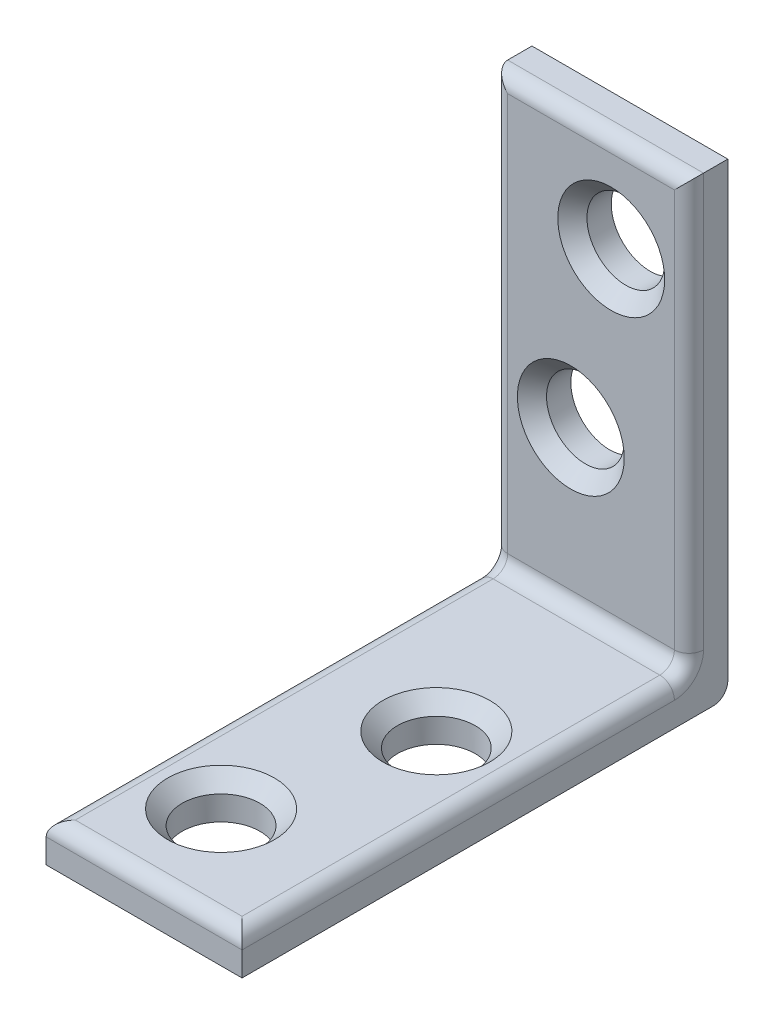
ISO-10303-21;
HEADER;
FILE_DESCRIPTION(('STEP AP214'),'2;1');
FILE_NAME('part.step','',(''),(''),'','','');
FILE_SCHEMA(('AUTOMOTIVE_DESIGN { 1 0 10303 214 1 1 1 1 }'));
ENDSEC;
DATA;
#1=APPLICATION_CONTEXT('core data for automotive mechanical design processes');
#2=APPLICATION_PROTOCOL_DEFINITION('international standard','automotive_design',2000,#1);
#3=PRODUCT_CONTEXT('',#1,'mechanical');
#4=PRODUCT('Part','Part','',(#3));
#5=PRODUCT_RELATED_PRODUCT_CATEGORY('part','',(#4));
#6=PRODUCT_DEFINITION_FORMATION('','',#4);
#7=PRODUCT_DEFINITION_CONTEXT('part definition',#1,'design');
#8=PRODUCT_DEFINITION('design','',#6,#7);
#9=PRODUCT_DEFINITION_SHAPE('','',#8);
#10=(LENGTH_UNIT() NAMED_UNIT(*) SI_UNIT(.MILLI.,.METRE.));
#11=(NAMED_UNIT(*) PLANE_ANGLE_UNIT() SI_UNIT($,.RADIAN.));
#12=(NAMED_UNIT(*) SI_UNIT($,.STERADIAN.) SOLID_ANGLE_UNIT());
#13=UNCERTAINTY_MEASURE_WITH_UNIT(LENGTH_MEASURE(1.E-05),#10,'distance_accuracy_value','');
#14=(GEOMETRIC_REPRESENTATION_CONTEXT(3) GLOBAL_UNCERTAINTY_ASSIGNED_CONTEXT((#13)) GLOBAL_UNIT_ASSIGNED_CONTEXT((#10,
#11,#12)) REPRESENTATION_CONTEXT('',''));
#15=CARTESIAN_POINT('',(0.,0.,0.));
#16=DIRECTION('',(0.,0.,1.));
#17=DIRECTION('',(1.,0.,0.));
#18=AXIS2_PLACEMENT_3D('',#15,#16,#17);
#19=CARTESIAN_POINT('',(0.,3.175,0.));
#20=DIRECTION('',(1.,0.,0.));
#21=DIRECTION('',(0.,0.,-1.));
#22=AXIS2_PLACEMENT_3D('',#19,#20,#21);
#23=PLANE('',#22);
#24=DIRECTION('',(0.,-1.,0.));
#25=VECTOR('',#24,1.);
#26=CARTESIAN_POINT('',(0.,38.1,-39.6875));
#27=LINE('',#26,#25);
#28=CARTESIAN_POINT('',(0.,38.1,-39.6875));
#29=VERTEX_POINT('',#28);
#30=CARTESIAN_POINT('',(0.,1.19062500000001,-39.6875));
#31=VERTEX_POINT('',#30);
#32=EDGE_CURVE('E130',#29,#31,#27,.T.);
#33=ORIENTED_EDGE('',*,*,#32,.T.);
#34=CARTESIAN_POINT('',(0.,1.190625,-38.496875));
#35=DIRECTION('',(1.,0.,0.));
#36=DIRECTION('',(0.,0.,-1.));
#37=AXIS2_PLACEMENT_3D('',#34,#35,#36);
#38=CIRCLE('',#37,1.190625);
#39=CARTESIAN_POINT('',(0.,0.,-38.496875));
#40=VERTEX_POINT('',#39);
#41=EDGE_CURVE('E213',#31,#40,#38,.F.);
#42=ORIENTED_EDGE('',*,*,#41,.T.);
#43=DIRECTION('',(0.,0.,1.));
#44=VECTOR('',#43,1.);
#45=CARTESIAN_POINT('',(0.,0.,0.));
#46=LINE('',#45,#44);
#47=CARTESIAN_POINT('',(0.,0.,0.));
#48=VERTEX_POINT('',#47);
#49=EDGE_CURVE('E156',#40,#48,#46,.T.);
#50=ORIENTED_EDGE('',*,*,#49,.T.);
#51=DIRECTION('',(0.,-1.,0.));
#52=VECTOR('',#51,1.);
#53=CARTESIAN_POINT('',(0.,3.175,0.));
#54=LINE('',#53,#52);
#55=CARTESIAN_POINT('',(0.,1.984375,0.));
#56=VERTEX_POINT('',#55);
#57=EDGE_CURVE('E168',#56,#48,#54,.T.);
#58=ORIENTED_EDGE('',*,*,#57,.F.);
#59=DIRECTION('',(0.,0.,1.));
#60=VECTOR('',#59,1.);
#61=CARTESIAN_POINT('',(0.,1.984375,0.));
#62=LINE('',#61,#60);
#63=CARTESIAN_POINT('',(0.,1.984375,-35.321875));
#64=VERTEX_POINT('',#63);
#65=EDGE_CURVE('E210',#56,#64,#62,.F.);
#66=ORIENTED_EDGE('',*,*,#65,.T.);
#67=CARTESIAN_POINT('',(0.,4.365625,-35.321875));
#68=DIRECTION('',(1.,0.,0.));
#69=DIRECTION('',(0.,0.,-1.));
#70=AXIS2_PLACEMENT_3D('',#67,#68,#69);
#71=CIRCLE('',#70,2.38125);
#72=CARTESIAN_POINT('',(0.,4.365625,-37.703125));
#73=VERTEX_POINT('',#72);
#74=EDGE_CURVE('E207',#73,#64,#71,.F.);
#75=ORIENTED_EDGE('',*,*,#74,.F.);
#76=DIRECTION('',(0.,-1.,0.));
#77=VECTOR('',#76,1.);
#78=CARTESIAN_POINT('',(0.,38.1,-37.703125));
#79=LINE('',#78,#77);
#80=CARTESIAN_POINT('',(0.,38.1,-37.703125));
#81=VERTEX_POINT('',#80);
#82=EDGE_CURVE('E133',#73,#81,#79,.F.);
#83=ORIENTED_EDGE('',*,*,#82,.T.);
#84=DIRECTION('',(0.,0.,-1.));
#85=VECTOR('',#84,1.);
#86=CARTESIAN_POINT('',(0.,38.1,-39.6875));
#87=LINE('',#86,#85);
#88=EDGE_CURVE('E128',#81,#29,#87,.T.);
#89=ORIENTED_EDGE('',*,*,#88,.T.);
#90=EDGE_LOOP('',(#33,#42,#50,#58,#66,#75,#83,#89));
#91=FACE_BOUND('',#90,.T.);
#92=ADVANCED_FACE('F35',(#91),#23,.F.);
#93=CARTESIAN_POINT('',(0.,3.175,0.));
#94=DIRECTION('',(0.,0.,-1.));
#95=DIRECTION('',(-1.,0.,0.));
#96=AXIS2_PLACEMENT_3D('',#93,#94,#95);
#97=PLANE('',#96);
#98=DIRECTION('',(0.,-1.,0.));
#99=VECTOR('',#98,1.);
#100=CARTESIAN_POINT('',(16.002,3.175,0.));
#101=LINE('',#100,#99);
#102=CARTESIAN_POINT('',(16.002,1.984375,0.));
#103=VERTEX_POINT('',#102);
#104=CARTESIAN_POINT('',(16.002,0.,0.));
#105=VERTEX_POINT('',#104);
#106=EDGE_CURVE('E166',#103,#105,#101,.T.);
#107=ORIENTED_EDGE('',*,*,#106,.F.);
#108=DIRECTION('',(1.,0.,0.));
#109=VECTOR('',#108,1.);
#110=CARTESIAN_POINT('',(0.,1.984375,0.));
#111=LINE('',#110,#109);
#112=EDGE_CURVE('E44',#103,#56,#111,.F.);
#113=ORIENTED_EDGE('',*,*,#112,.T.);
#114=ORIENTED_EDGE('',*,*,#57,.T.);
#115=DIRECTION('',(1.,0.,0.));
#116=VECTOR('',#115,1.);
#117=CARTESIAN_POINT('',(0.,0.,0.));
#118=LINE('',#117,#116);
#119=EDGE_CURVE('E160',#48,#105,#118,.T.);
#120=ORIENTED_EDGE('',*,*,#119,.T.);
#121=EDGE_LOOP('',(#107,#113,#114,#120));
#122=FACE_BOUND('',#121,.T.);
#123=ADVANCED_FACE('F291',(#122),#97,.F.);
#124=CARTESIAN_POINT('',(16.002,3.175,0.));
#125=DIRECTION('',(-1.,0.,0.));
#126=DIRECTION('',(0.,0.,1.));
#127=AXIS2_PLACEMENT_3D('',#124,#125,#126);
#128=PLANE('',#127);
#129=DIRECTION('',(0.,0.,-1.));
#130=VECTOR('',#129,1.);
#131=CARTESIAN_POINT('',(16.002,0.,0.));
#132=LINE('',#131,#130);
#133=CARTESIAN_POINT('',(16.002,0.,-38.496875));
#134=VERTEX_POINT('',#133);
#135=EDGE_CURVE('E163',#105,#134,#132,.T.);
#136=ORIENTED_EDGE('',*,*,#135,.T.);
#137=CARTESIAN_POINT('',(16.002,1.190625,-38.496875));
#138=DIRECTION('',(-1.,0.,0.));
#139=DIRECTION('',(0.,0.,1.));
#140=AXIS2_PLACEMENT_3D('',#137,#138,#139);
#141=CIRCLE('',#140,1.190625);
#142=CARTESIAN_POINT('',(16.002,1.19062500000001,-39.6875));
#143=VERTEX_POINT('',#142);
#144=EDGE_CURVE('E204',#134,#143,#141,.F.);
#145=ORIENTED_EDGE('',*,*,#144,.T.);
#146=DIRECTION('',(0.,-1.,0.));
#147=VECTOR('',#146,1.);
#148=CARTESIAN_POINT('',(16.002,38.1,-39.6875));
#149=LINE('',#148,#147);
#150=CARTESIAN_POINT('',(16.002,38.1,-39.6875));
#151=VERTEX_POINT('',#150);
#152=EDGE_CURVE('E146',#151,#143,#149,.T.);
#153=ORIENTED_EDGE('',*,*,#152,.F.);
#154=DIRECTION('',(0.,0.,1.));
#155=VECTOR('',#154,1.);
#156=CARTESIAN_POINT('',(16.002,38.1,-39.6875));
#157=LINE('',#156,#155);
#158=CARTESIAN_POINT('',(16.002,38.1,-37.703125));
#159=VERTEX_POINT('',#158);
#160=EDGE_CURVE('E147',#151,#159,#157,.T.);
#161=ORIENTED_EDGE('',*,*,#160,.T.);
#162=DIRECTION('',(0.,-1.,0.));
#163=VECTOR('',#162,1.);
#164=CARTESIAN_POINT('',(16.002,3.175,-37.703125));
#165=LINE('',#164,#163);
#166=CARTESIAN_POINT('',(16.002,4.365625,-37.703125));
#167=VERTEX_POINT('',#166);
#168=EDGE_CURVE('E200',#159,#167,#165,.T.);
#169=ORIENTED_EDGE('',*,*,#168,.T.);
#170=CARTESIAN_POINT('',(16.002,4.365625,-35.321875));
#171=DIRECTION('',(-1.,0.,0.));
#172=DIRECTION('',(0.,0.,1.));
#173=AXIS2_PLACEMENT_3D('',#170,#171,#172);
#174=CIRCLE('',#173,2.38125);
#175=CARTESIAN_POINT('',(16.002,1.984375,-35.321875));
#176=VERTEX_POINT('',#175);
#177=EDGE_CURVE('E197',#176,#167,#174,.F.);
#178=ORIENTED_EDGE('',*,*,#177,.F.);
#179=DIRECTION('',(0.,0.,-1.));
#180=VECTOR('',#179,1.);
#181=CARTESIAN_POINT('',(16.002,1.984375,0.));
#182=LINE('',#181,#180);
#183=EDGE_CURVE('E202',#176,#103,#182,.F.);
#184=ORIENTED_EDGE('',*,*,#183,.T.);
#185=ORIENTED_EDGE('',*,*,#106,.T.);
#186=EDGE_LOOP('',(#136,#145,#153,#161,#169,#178,#184,#185));
#187=FACE_BOUND('',#186,.T.);
#188=ADVANCED_FACE('F296',(#187),#128,.F.);
#189=CARTESIAN_POINT('',(0.,3.175,0.));
#190=DIRECTION('',(0.,-1.,0.));
#191=DIRECTION('',(0.,0.,-1.));
#192=AXIS2_PLACEMENT_3D('',#189,#190,#191);
#193=PLANE('',#192);
#194=DIRECTION('',(1.,0.,0.));
#195=VECTOR('',#194,1.);
#196=CARTESIAN_POINT('',(0.,3.175,-1.190625));
#197=LINE('',#196,#195);
#198=CARTESIAN_POINT('',(1.190625,3.175,-1.190625));
#199=VERTEX_POINT('',#198);
#200=CARTESIAN_POINT('',(14.811375,3.175,-1.190625));
#201=VERTEX_POINT('',#200);
#202=EDGE_CURVE('E217',#199,#201,#197,.T.);
#203=ORIENTED_EDGE('',*,*,#202,.T.);
#204=DIRECTION('',(0.,0.,-1.));
#205=VECTOR('',#204,1.);
#206=CARTESIAN_POINT('',(14.811375,3.175,0.));
#207=LINE('',#206,#205);
#208=CARTESIAN_POINT('',(14.811375,3.175,-35.321875));
#209=VERTEX_POINT('',#208);
#210=EDGE_CURVE('E222',#201,#209,#207,.T.);
#211=ORIENTED_EDGE('',*,*,#210,.T.);
#212=DIRECTION('',(-1.,0.,0.));
#213=VECTOR('',#212,1.);
#214=CARTESIAN_POINT('',(0.,3.175,-35.321875));
#215=LINE('',#214,#213);
#216=CARTESIAN_POINT('',(1.190625,3.175,-35.321875));
#217=VERTEX_POINT('',#216);
#218=EDGE_CURVE('E219',#209,#217,#215,.T.);
#219=ORIENTED_EDGE('',*,*,#218,.T.);
#220=DIRECTION('',(0.,0.,1.));
#221=VECTOR('',#220,1.);
#222=CARTESIAN_POINT('',(1.190625,3.175,0.));
#223=LINE('',#222,#221);
#224=EDGE_CURVE('E215',#217,#199,#223,.T.);
#225=ORIENTED_EDGE('',*,*,#224,.T.);
#226=EDGE_LOOP('',(#203,#211,#219,#225));
#227=FACE_BOUND('',#226,.T.);
#228=CARTESIAN_POINT('',(6.35,3.175,-7.9375));
#229=DIRECTION('',(0.,-1.,0.));
#230=DIRECTION('',(0.,0.,-1.));
#231=AXIS2_PLACEMENT_3D('',#228,#229,#230);
#232=CIRCLE('',#231,4.365625);
#233=CARTESIAN_POINT('',(6.35,3.175,-12.303125));
#234=VERTEX_POINT('',#233);
#235=EDGE_CURVE('E188',#234,#234,#232,.T.);
#236=ORIENTED_EDGE('',*,*,#235,.T.);
#237=EDGE_LOOP('',(#236));
#238=FACE_BOUND('',#237,.T.);
#239=CARTESIAN_POINT('',(9.652,3.175,-22.225));
#240=DIRECTION('',(0.,-1.,0.));
#241=DIRECTION('',(0.,0.,-1.));
#242=AXIS2_PLACEMENT_3D('',#239,#240,#241);
#243=CIRCLE('',#242,4.365625);
#244=CARTESIAN_POINT('',(9.652,3.175,-26.590625));
#245=VERTEX_POINT('',#244);
#246=EDGE_CURVE('E185',#245,#245,#243,.T.);
#247=ORIENTED_EDGE('',*,*,#246,.T.);
#248=EDGE_LOOP('',(#247));
#249=FACE_BOUND('',#248,.T.);
#250=ADVANCED_FACE('F364',(#227,#238,#249),#193,.F.);
#251=CARTESIAN_POINT('',(0.,0.,0.));
#252=DIRECTION('',(0.,-1.,0.));
#253=DIRECTION('',(0.,0.,-1.));
#254=AXIS2_PLACEMENT_3D('',#251,#252,#253);
#255=PLANE('',#254);
#256=CARTESIAN_POINT('',(6.35,0.,-7.9375));
#257=DIRECTION('',(0.,1.,0.));
#258=DIRECTION('',(0.,0.,1.));
#259=AXIS2_PLACEMENT_3D('',#256,#257,#258);
#260=CIRCLE('',#259,3.175);
#261=CARTESIAN_POINT('',(6.35,0.,-4.7625));
#262=VERTEX_POINT('',#261);
#263=EDGE_CURVE('E259',#262,#262,#260,.T.);
#264=ORIENTED_EDGE('',*,*,#263,.T.);
#265=EDGE_LOOP('',(#264));
#266=FACE_BOUND('',#265,.T.);
#267=CARTESIAN_POINT('',(9.652,0.,-22.225));
#268=DIRECTION('',(0.,1.,0.));
#269=DIRECTION('',(0.,0.,1.));
#270=AXIS2_PLACEMENT_3D('',#267,#268,#269);
#271=CIRCLE('',#270,3.175);
#272=CARTESIAN_POINT('',(9.652,0.,-19.05));
#273=VERTEX_POINT('',#272);
#274=EDGE_CURVE('E264',#273,#273,#271,.T.);
#275=ORIENTED_EDGE('',*,*,#274,.T.);
#276=EDGE_LOOP('',(#275));
#277=FACE_BOUND('',#276,.T.);
#278=ORIENTED_EDGE('',*,*,#49,.F.);
#279=DIRECTION('',(1.,0.,0.));
#280=VECTOR('',#279,1.);
#281=CARTESIAN_POINT('',(0.,0.,-38.496875));
#282=LINE('',#281,#280);
#283=EDGE_CURVE('E194',#40,#134,#282,.T.);
#284=ORIENTED_EDGE('',*,*,#283,.T.);
#285=ORIENTED_EDGE('',*,*,#135,.F.);
#286=ORIENTED_EDGE('',*,*,#119,.F.);
#287=EDGE_LOOP('',(#278,#284,#285,#286));
#288=FACE_BOUND('',#287,.T.);
#289=ADVANCED_FACE('F374',(#266,#277,#288),#255,.T.);
#290=CARTESIAN_POINT('',(0.,38.1,-36.5125));
#291=DIRECTION('',(0.,0.,1.));
#292=DIRECTION('',(1.,0.,0.));
#293=AXIS2_PLACEMENT_3D('',#290,#291,#292);
#294=PLANE('',#293);
#295=DIRECTION('',(0.,-1.,0.));
#296=VECTOR('',#295,1.);
#297=CARTESIAN_POINT('',(1.190625,3.175,-36.5125));
#298=LINE('',#297,#296);
#299=CARTESIAN_POINT('',(1.190625,36.909375,-36.5125));
#300=VERTEX_POINT('',#299);
#301=CARTESIAN_POINT('',(1.190625,4.365625,-36.5125));
#302=VERTEX_POINT('',#301);
#303=EDGE_CURVE('E224',#300,#302,#298,.T.);
#304=ORIENTED_EDGE('',*,*,#303,.T.);
#305=DIRECTION('',(-1.,0.,0.));
#306=VECTOR('',#305,1.);
#307=CARTESIAN_POINT('',(0.,4.365625,-36.5125));
#308=LINE('',#307,#306);
#309=CARTESIAN_POINT('',(14.811375,4.365625,-36.5125));
#310=VERTEX_POINT('',#309);
#311=EDGE_CURVE('E229',#302,#310,#308,.F.);
#312=ORIENTED_EDGE('',*,*,#311,.T.);
#313=DIRECTION('',(0.,-1.,0.));
#314=VECTOR('',#313,1.);
#315=CARTESIAN_POINT('',(14.811375,38.1,-36.5125));
#316=LINE('',#315,#314);
#317=CARTESIAN_POINT('',(14.811375,36.909375,-36.5125));
#318=VERTEX_POINT('',#317);
#319=EDGE_CURVE('E60',#310,#318,#316,.F.);
#320=ORIENTED_EDGE('',*,*,#319,.T.);
#321=DIRECTION('',(-1.,0.,0.));
#322=VECTOR('',#321,1.);
#323=CARTESIAN_POINT('',(0.,36.909375,-36.5125));
#324=LINE('',#323,#322);
#325=EDGE_CURVE('E226',#318,#300,#324,.T.);
#326=ORIENTED_EDGE('',*,*,#325,.T.);
#327=EDGE_LOOP('',(#304,#312,#320,#326));
#328=FACE_BOUND('',#327,.T.);
#329=CARTESIAN_POINT('',(6.35,15.875,-36.5125));
#330=DIRECTION('',(0.,0.,1.));
#331=DIRECTION('',(1.,0.,0.));
#332=AXIS2_PLACEMENT_3D('',#329,#330,#331);
#333=CIRCLE('',#332,4.36562500000003);
#334=CARTESIAN_POINT('',(10.715625,15.875,-36.5125));
#335=VERTEX_POINT('',#334);
#336=EDGE_CURVE('E176',#335,#335,#333,.F.);
#337=ORIENTED_EDGE('',*,*,#336,.T.);
#338=EDGE_LOOP('',(#337));
#339=FACE_BOUND('',#338,.T.);
#340=CARTESIAN_POINT('',(9.652,30.1625,-36.5125));
#341=DIRECTION('',(0.,0.,1.));
#342=DIRECTION('',(1.,0.,0.));
#343=AXIS2_PLACEMENT_3D('',#340,#341,#342);
#344=CIRCLE('',#343,4.36562500000003);
#345=CARTESIAN_POINT('',(14.017625,30.1625,-36.5125));
#346=VERTEX_POINT('',#345);
#347=EDGE_CURVE('E173',#346,#346,#344,.F.);
#348=ORIENTED_EDGE('',*,*,#347,.T.);
#349=EDGE_LOOP('',(#348));
#350=FACE_BOUND('',#349,.T.);
#351=ADVANCED_FACE('F356',(#328,#339,#350),#294,.T.);
#352=CARTESIAN_POINT('',(0.,38.1,-39.6875));
#353=DIRECTION('',(0.,0.,-1.));
#354=DIRECTION('',(-1.,0.,0.));
#355=AXIS2_PLACEMENT_3D('',#352,#353,#354);
#356=PLANE('',#355);
#357=CARTESIAN_POINT('',(6.35,15.875,-39.6875));
#358=DIRECTION('',(0.,0.,1.));
#359=DIRECTION('',(1.,0.,0.));
#360=AXIS2_PLACEMENT_3D('',#357,#358,#359);
#361=CIRCLE('',#360,3.175);
#362=CARTESIAN_POINT('',(9.525,15.875,-39.6875));
#363=VERTEX_POINT('',#362);
#364=EDGE_CURVE('E269',#363,#363,#361,.T.);
#365=ORIENTED_EDGE('',*,*,#364,.T.);
#366=EDGE_LOOP('',(#365));
#367=FACE_BOUND('',#366,.T.);
#368=CARTESIAN_POINT('',(9.652,30.1625,-39.6875));
#369=DIRECTION('',(0.,0.,1.));
#370=DIRECTION('',(1.,0.,0.));
#371=AXIS2_PLACEMENT_3D('',#368,#369,#370);
#372=CIRCLE('',#371,3.175);
#373=CARTESIAN_POINT('',(12.827,30.1625,-39.6875));
#374=VERTEX_POINT('',#373);
#375=EDGE_CURVE('E138',#374,#374,#372,.T.);
#376=ORIENTED_EDGE('',*,*,#375,.T.);
#377=EDGE_LOOP('',(#376));
#378=FACE_BOUND('',#377,.T.);
#379=ORIENTED_EDGE('',*,*,#152,.T.);
#380=DIRECTION('',(1.,0.,0.));
#381=VECTOR('',#380,1.);
#382=CARTESIAN_POINT('',(0.,1.190625,-39.6875));
#383=LINE('',#382,#381);
#384=EDGE_CURVE('E145',#143,#31,#383,.F.);
#385=ORIENTED_EDGE('',*,*,#384,.T.);
#386=ORIENTED_EDGE('',*,*,#32,.F.);
#387=DIRECTION('',(1.,0.,0.));
#388=VECTOR('',#387,1.);
#389=CARTESIAN_POINT('',(0.,38.1,-39.6875));
#390=LINE('',#389,#388);
#391=EDGE_CURVE('E137',#29,#151,#390,.T.);
#392=ORIENTED_EDGE('',*,*,#391,.T.);
#393=EDGE_LOOP('',(#379,#385,#386,#392));
#394=FACE_BOUND('',#393,.T.);
#395=ADVANCED_FACE('F143',(#367,#378,#394),#356,.T.);
#396=CARTESIAN_POINT('',(0.,38.1,0.));
#397=DIRECTION('',(0.,1.,0.));
#398=DIRECTION('',(0.,0.,1.));
#399=AXIS2_PLACEMENT_3D('',#396,#397,#398);
#400=PLANE('',#399);
#401=ORIENTED_EDGE('',*,*,#88,.F.);
#402=DIRECTION('',(-1.,0.,0.));
#403=VECTOR('',#402,1.);
#404=CARTESIAN_POINT('',(0.,38.1,-37.703125));
#405=LINE('',#404,#403);
#406=EDGE_CURVE('E11',#81,#159,#405,.F.);
#407=ORIENTED_EDGE('',*,*,#406,.T.);
#408=ORIENTED_EDGE('',*,*,#160,.F.);
#409=ORIENTED_EDGE('',*,*,#391,.F.);
#410=EDGE_LOOP('',(#401,#407,#408,#409));
#411=FACE_BOUND('',#410,.T.);
#412=ADVANCED_FACE('F150',(#411),#400,.T.);
#413=CARTESIAN_POINT('',(9.652,30.1625,-39.6875));
#414=DIRECTION('',(0.,0.,1.));
#415=DIRECTION('',(1.,0.,0.));
#416=AXIS2_PLACEMENT_3D('',#413,#414,#415);
#417=CYLINDRICAL_SURFACE('',#416,3.175);
#418=CARTESIAN_POINT('',(9.652,30.1625,-37.703125));
#419=DIRECTION('',(0.,0.,1.));
#420=DIRECTION('',(1.,0.,0.));
#421=AXIS2_PLACEMENT_3D('',#418,#419,#420);
#422=CIRCLE('',#421,3.175);
#423=CARTESIAN_POINT('',(12.827,30.1625,-37.703125));
#424=VERTEX_POINT('',#423);
#425=EDGE_CURVE('E179',#424,#424,#422,.T.);
#426=CARTESIAN_POINT('',(12.827,30.1625,-37.703125));
#427=CARTESIAN_POINT('',(12.827,30.1625,-37.7237955729167));
#428=CARTESIAN_POINT('',(12.827,30.1625,-37.7444661458334));
#429=CARTESIAN_POINT('',(12.827,30.1625,-37.7858072916667));
#430=CARTESIAN_POINT('',(12.827,30.1625,-37.8064778645834));
#431=CARTESIAN_POINT('',(12.827,30.1625,-37.8478190104167));
#432=CARTESIAN_POINT('',(12.827,30.1625,-37.8684895833334));
#433=CARTESIAN_POINT('',(12.827,30.1625,-37.9098307291667));
#434=CARTESIAN_POINT('',(12.827,30.1625,-37.9305013020834));
#435=CARTESIAN_POINT('',(12.827,30.1625,-37.9718424479167));
#436=CARTESIAN_POINT('',(12.827,30.1625,-37.9925130208334));
#437=CARTESIAN_POINT('',(12.827,30.1625,-38.0338541666667));
#438=CARTESIAN_POINT('',(12.827,30.1625,-38.0545247395834));
#439=CARTESIAN_POINT('',(12.827,30.1625,-38.0958658854167));
#440=CARTESIAN_POINT('',(12.827,30.1625,-38.1165364583334));
#441=CARTESIAN_POINT('',(12.827,30.1625,-38.1578776041667));
#442=CARTESIAN_POINT('',(12.827,30.1625,-38.1785481770834));
#443=CARTESIAN_POINT('',(12.827,30.1625,-38.2198893229167));
#444=CARTESIAN_POINT('',(12.827,30.1625,-38.2405598958333));
#445=CARTESIAN_POINT('',(12.827,30.1625,-38.2819010416667));
#446=CARTESIAN_POINT('',(12.827,30.1625,-38.3025716145834));
#447=CARTESIAN_POINT('',(12.827,30.1625,-38.3439127604167));
#448=CARTESIAN_POINT('',(12.827,30.1625,-38.3645833333334));
#449=CARTESIAN_POINT('',(12.827,30.1625,-38.4059244791667));
#450=CARTESIAN_POINT('',(12.827,30.1625,-38.4265950520833));
#451=CARTESIAN_POINT('',(12.827,30.1625,-38.4679361979167));
#452=CARTESIAN_POINT('',(12.827,30.1625,-38.4886067708333));
#453=CARTESIAN_POINT('',(12.827,30.1625,-38.5299479166667));
#454=CARTESIAN_POINT('',(12.827,30.1625,-38.5506184895834));
#455=CARTESIAN_POINT('',(12.827,30.1625,-38.5919596354167));
#456=CARTESIAN_POINT('',(12.827,30.1625,-38.6126302083333));
#457=CARTESIAN_POINT('',(12.827,30.1625,-38.6539713541667));
#458=CARTESIAN_POINT('',(12.827,30.1625,-38.6746419270833));
#459=CARTESIAN_POINT('',(12.827,30.1625,-38.7159830729167));
#460=CARTESIAN_POINT('',(12.827,30.1625,-38.7366536458333));
#461=CARTESIAN_POINT('',(12.827,30.1625,-38.7779947916667));
#462=CARTESIAN_POINT('',(12.827,30.1625,-38.7986653645833));
#463=CARTESIAN_POINT('',(12.827,30.1625,-38.8400065104167));
#464=CARTESIAN_POINT('',(12.827,30.1625,-38.8606770833333));
#465=CARTESIAN_POINT('',(12.827,30.1625,-38.9020182291667));
#466=CARTESIAN_POINT('',(12.827,30.1625,-38.9226888020833));
#467=CARTESIAN_POINT('',(12.827,30.1625,-38.9640299479167));
#468=CARTESIAN_POINT('',(12.827,30.1625,-38.9847005208333));
#469=CARTESIAN_POINT('',(12.827,30.1625,-39.0260416666667));
#470=CARTESIAN_POINT('',(12.827,30.1625,-39.0467122395833));
#471=CARTESIAN_POINT('',(12.827,30.1625,-39.0880533854167));
#472=CARTESIAN_POINT('',(12.827,30.1625,-39.1087239583333));
#473=CARTESIAN_POINT('',(12.827,30.1625,-39.1500651041667));
#474=CARTESIAN_POINT('',(12.827,30.1625,-39.1707356770833));
#475=CARTESIAN_POINT('',(12.827,30.1625,-39.2120768229167));
#476=CARTESIAN_POINT('',(12.827,30.1625,-39.2327473958333));
#477=CARTESIAN_POINT('',(12.827,30.1625,-39.2740885416667));
#478=CARTESIAN_POINT('',(12.827,30.1625,-39.2947591145833));
#479=CARTESIAN_POINT('',(12.827,30.1625,-39.3361002604167));
#480=CARTESIAN_POINT('',(12.827,30.1625,-39.3567708333333));
#481=CARTESIAN_POINT('',(12.827,30.1625,-39.3981119791667));
#482=CARTESIAN_POINT('',(12.827,30.1625,-39.4187825520833));
#483=CARTESIAN_POINT('',(12.827,30.1625,-39.4601236979167));
#484=CARTESIAN_POINT('',(12.827,30.1625,-39.4807942708333));
#485=CARTESIAN_POINT('',(12.827,30.1625,-39.5221354166667));
#486=CARTESIAN_POINT('',(12.827,30.1625,-39.5428059895833));
#487=CARTESIAN_POINT('',(12.827,30.1625,-39.5841471354167));
#488=CARTESIAN_POINT('',(12.827,30.1625,-39.6048177083333));
#489=CARTESIAN_POINT('',(12.827,30.1625,-39.6461588541667));
#490=CARTESIAN_POINT('',(12.827,30.1625,-39.6668294270833));
#491=CARTESIAN_POINT('',(12.827,30.1625,-39.6875));
#492=B_SPLINE_CURVE_WITH_KNOTS('',3,(#426,#427,#428,#429,#430,#431,#432,#433,#434,#435,#436,
#437,#438,#439,#440,#441,#442,#443,#444,#445,#446,#447,#448,#449,#450,#451,#452,#453,#454,#455,
#456,#457,#458,#459,#460,#461,#462,#463,#464,#465,#466,#467,#468,#469,#470,#471,#472,#473,#474,
#475,#476,#477,#478,#479,#480,#481,#482,#483,#484,#485,#486,#487,#488,#489,#490,#491),
.UNSPECIFIED.,.F.,.F.,(4,2,2,2,2,2,2,2,2,2,2,2,2,2,2,2,2,2,2,2,2,2,2,2,2,2,2,2,2,2,2,2,4),(0.,
0.0620117187500047,0.124023437500002,0.18603515625,0.248046874999998,0.310058593750002,
0.3720703125,0.434082031249998,0.496093749999996,0.558105468749993,0.620117187499998,
0.682128906249996,0.744140624999994,0.806152343749991,0.868164062499996,0.930175781249994,
0.992187499999991,1.05419921874999,1.11621093749999,1.17822265624999,1.24023437499999,
1.30224609374999,1.36425781249998,1.42626953124999,1.48828124999999,1.55029296874998,
1.61230468749998,1.67431640624998,1.73632812499998,1.79833984374998,1.86035156249998,
1.92236328124998,1.98437499999998),.UNSPECIFIED.);
#493=EDGE_CURVE('BSEAM277',#424,#374,#492,.T.);
#494=ORIENTED_EDGE('',*,*,#425,.T.);
#495=ORIENTED_EDGE('',*,*,#375,.F.);
#496=ORIENTED_EDGE('',*,*,#493,.T.);
#497=ORIENTED_EDGE('',*,*,#493,.F.);
#498=EDGE_LOOP('',(#494,#496,#495,#497));
#499=FACE_BOUND('',#498,.T.);
#500=ADVANCED_FACE('F277',(#499),#417,.F.);
#501=CARTESIAN_POINT('',(6.35,15.875,-39.6875));
#502=DIRECTION('',(0.,0.,1.));
#503=DIRECTION('',(1.,0.,0.));
#504=AXIS2_PLACEMENT_3D('',#501,#502,#503);
#505=CYLINDRICAL_SURFACE('',#504,3.175);
#506=CARTESIAN_POINT('',(6.35,15.875,-37.703125));
#507=DIRECTION('',(0.,0.,1.));
#508=DIRECTION('',(1.,0.,0.));
#509=AXIS2_PLACEMENT_3D('',#506,#507,#508);
#510=CIRCLE('',#509,3.175);
#511=CARTESIAN_POINT('',(9.525,15.875,-37.703125));
#512=VERTEX_POINT('',#511);
#513=EDGE_CURVE('E170',#512,#512,#510,.T.);
#514=CARTESIAN_POINT('',(9.525,15.875,-37.703125));
#515=CARTESIAN_POINT('',(9.525,15.875,-37.7237955729167));
#516=CARTESIAN_POINT('',(9.525,15.875,-37.7444661458334));
#517=CARTESIAN_POINT('',(9.525,15.875,-37.7858072916667));
#518=CARTESIAN_POINT('',(9.525,15.875,-37.8064778645834));
#519=CARTESIAN_POINT('',(9.525,15.875,-37.8478190104167));
#520=CARTESIAN_POINT('',(9.525,15.875,-37.8684895833333));
#521=CARTESIAN_POINT('',(9.525,15.875,-37.9098307291667));
#522=CARTESIAN_POINT('',(9.525,15.875,-37.9305013020834));
#523=CARTESIAN_POINT('',(9.525,15.875,-37.9718424479167));
#524=CARTESIAN_POINT('',(9.525,15.875,-37.9925130208334));
#525=CARTESIAN_POINT('',(9.525,15.875,-38.0338541666667));
#526=CARTESIAN_POINT('',(9.525,15.875,-38.0545247395833));
#527=CARTESIAN_POINT('',(9.525,15.875,-38.0958658854167));
#528=CARTESIAN_POINT('',(9.525,15.875,-38.1165364583333));
#529=CARTESIAN_POINT('',(9.525,15.875,-38.1578776041667));
#530=CARTESIAN_POINT('',(9.525,15.875,-38.1785481770834));
#531=CARTESIAN_POINT('',(9.525,15.875,-38.2198893229167));
#532=CARTESIAN_POINT('',(9.525,15.875,-38.2405598958333));
#533=CARTESIAN_POINT('',(9.525,15.875,-38.2819010416667));
#534=CARTESIAN_POINT('',(9.525,15.875,-38.3025716145833));
#535=CARTESIAN_POINT('',(9.525,15.875,-38.3439127604167));
#536=CARTESIAN_POINT('',(9.525,15.875,-38.3645833333333));
#537=CARTESIAN_POINT('',(9.525,15.875,-38.4059244791667));
#538=CARTESIAN_POINT('',(9.525,15.875,-38.4265950520833));
#539=CARTESIAN_POINT('',(9.525,15.875,-38.4679361979167));
#540=CARTESIAN_POINT('',(9.525,15.875,-38.4886067708333));
#541=CARTESIAN_POINT('',(9.525,15.875,-38.5299479166667));
#542=CARTESIAN_POINT('',(9.525,15.875,-38.5506184895833));
#543=CARTESIAN_POINT('',(9.525,15.875,-38.5919596354167));
#544=CARTESIAN_POINT('',(9.525,15.875,-38.6126302083333));
#545=CARTESIAN_POINT('',(9.525,15.875,-38.6539713541667));
#546=CARTESIAN_POINT('',(9.525,15.875,-38.6746419270833));
#547=CARTESIAN_POINT('',(9.525,15.875,-38.7159830729167));
#548=CARTESIAN_POINT('',(9.525,15.875,-38.7366536458333));
#549=CARTESIAN_POINT('',(9.525,15.875,-38.7779947916667));
#550=CARTESIAN_POINT('',(9.525,15.875,-38.7986653645833));
#551=CARTESIAN_POINT('',(9.525,15.875,-38.8400065104167));
#552=CARTESIAN_POINT('',(9.525,15.875,-38.8606770833333));
#553=CARTESIAN_POINT('',(9.525,15.875,-38.9020182291667));
#554=CARTESIAN_POINT('',(9.525,15.875,-38.9226888020833));
#555=CARTESIAN_POINT('',(9.525,15.875,-38.9640299479167));
#556=CARTESIAN_POINT('',(9.525,15.875,-38.9847005208333));
#557=CARTESIAN_POINT('',(9.525,15.875,-39.0260416666667));
#558=CARTESIAN_POINT('',(9.525,15.875,-39.0467122395833));
#559=CARTESIAN_POINT('',(9.525,15.875,-39.0880533854167));
#560=CARTESIAN_POINT('',(9.525,15.875,-39.1087239583333));
#561=CARTESIAN_POINT('',(9.525,15.875,-39.1500651041667));
#562=CARTESIAN_POINT('',(9.525,15.875,-39.1707356770833));
#563=CARTESIAN_POINT('',(9.525,15.875,-39.2120768229167));
#564=CARTESIAN_POINT('',(9.525,15.875,-39.2327473958333));
#565=CARTESIAN_POINT('',(9.525,15.875,-39.2740885416667));
#566=CARTESIAN_POINT('',(9.525,15.875,-39.2947591145833));
#567=CARTESIAN_POINT('',(9.525,15.875,-39.3361002604167));
#568=CARTESIAN_POINT('',(9.525,15.875,-39.3567708333333));
#569=CARTESIAN_POINT('',(9.525,15.875,-39.3981119791667));
#570=CARTESIAN_POINT('',(9.525,15.875,-39.4187825520833));
#571=CARTESIAN_POINT('',(9.525,15.875,-39.4601236979167));
#572=CARTESIAN_POINT('',(9.525,15.875,-39.4807942708333));
#573=CARTESIAN_POINT('',(9.525,15.875,-39.5221354166667));
#574=CARTESIAN_POINT('',(9.525,15.875,-39.5428059895833));
#575=CARTESIAN_POINT('',(9.525,15.875,-39.5841471354167));
#576=CARTESIAN_POINT('',(9.525,15.875,-39.6048177083333));
#577=CARTESIAN_POINT('',(9.525,15.875,-39.6461588541667));
#578=CARTESIAN_POINT('',(9.525,15.875,-39.6668294270833));
#579=CARTESIAN_POINT('',(9.525,15.875,-39.6875));
#580=B_SPLINE_CURVE_WITH_KNOTS('',3,(#514,#515,#516,#517,#518,#519,#520,#521,#522,#523,#524,
#525,#526,#527,#528,#529,#530,#531,#532,#533,#534,#535,#536,#537,#538,#539,#540,#541,#542,#543,
#544,#545,#546,#547,#548,#549,#550,#551,#552,#553,#554,#555,#556,#557,#558,#559,#560,#561,#562,
#563,#564,#565,#566,#567,#568,#569,#570,#571,#572,#573,#574,#575,#576,#577,#578,#579),
.UNSPECIFIED.,.F.,.F.,(4,2,2,2,2,2,2,2,2,2,2,2,2,2,2,2,2,2,2,2,2,2,2,2,2,2,2,2,2,2,2,2,4),(0.,
0.0620117187499977,0.124023437499995,0.186035156249993,0.248046874999998,0.310058593749996,
0.372070312499993,0.434082031249991,0.496093749999996,0.558105468749993,0.620117187499991,
0.682128906249989,0.744140624999994,0.806152343749991,0.868164062499989,0.930175781249987,
0.992187499999991,1.05419921874999,1.11621093749999,1.17822265624998,1.24023437499999,
1.30224609374999,1.36425781249998,1.42626953124998,1.48828124999999,1.55029296874998,
1.61230468749998,1.67431640624998,1.73632812499998,1.79833984374998,1.86035156249998,
1.92236328124998,1.98437499999998),.UNSPECIFIED.);
#581=EDGE_CURVE('BSEAM279',#512,#363,#580,.T.);
#582=ORIENTED_EDGE('',*,*,#513,.T.);
#583=ORIENTED_EDGE('',*,*,#364,.F.);
#584=ORIENTED_EDGE('',*,*,#581,.T.);
#585=ORIENTED_EDGE('',*,*,#581,.F.);
#586=EDGE_LOOP('',(#582,#584,#583,#585));
#587=FACE_BOUND('',#586,.T.);
#588=ADVANCED_FACE('F279',(#587),#505,.F.);
#589=CARTESIAN_POINT('',(9.652,0.,-22.225));
#590=DIRECTION('',(0.,1.,0.));
#591=DIRECTION('',(0.,0.,1.));
#592=AXIS2_PLACEMENT_3D('',#589,#590,#591);
#593=CYLINDRICAL_SURFACE('',#592,3.175);
#594=CARTESIAN_POINT('',(9.652,1.984375,-22.225));
#595=DIRECTION('',(0.,-1.,0.));
#596=DIRECTION('',(0.,0.,-1.));
#597=AXIS2_PLACEMENT_3D('',#594,#595,#596);
#598=CIRCLE('',#597,3.175);
#599=CARTESIAN_POINT('',(9.652,1.984375,-25.4));
#600=VERTEX_POINT('',#599);
#601=EDGE_CURVE('E191',#600,#600,#598,.F.);
#602=ORIENTED_EDGE('',*,*,#601,.T.);
#603=EDGE_LOOP('',(#602));
#604=FACE_BOUND('',#603,.T.);
#605=ORIENTED_EDGE('',*,*,#274,.F.);
#606=EDGE_LOOP('',(#605));
#607=FACE_BOUND('',#606,.T.);
#608=ADVANCED_FACE('F286',(#604,#607),#593,.F.);
#609=CARTESIAN_POINT('',(6.35,0.,-7.9375));
#610=DIRECTION('',(0.,1.,0.));
#611=DIRECTION('',(0.,0.,1.));
#612=AXIS2_PLACEMENT_3D('',#609,#610,#611);
#613=CYLINDRICAL_SURFACE('',#612,3.175);
#614=CARTESIAN_POINT('',(6.35,1.984375,-7.9375));
#615=DIRECTION('',(0.,-1.,0.));
#616=DIRECTION('',(0.,0.,-1.));
#617=AXIS2_PLACEMENT_3D('',#614,#615,#616);
#618=CIRCLE('',#617,3.175);
#619=CARTESIAN_POINT('',(6.35,1.984375,-11.1125));
#620=VERTEX_POINT('',#619);
#621=EDGE_CURVE('E182',#620,#620,#618,.F.);
#622=ORIENTED_EDGE('',*,*,#621,.T.);
#623=EDGE_LOOP('',(#622));
#624=FACE_BOUND('',#623,.T.);
#625=ORIENTED_EDGE('',*,*,#263,.F.);
#626=EDGE_LOOP('',(#625));
#627=FACE_BOUND('',#626,.T.);
#628=ADVANCED_FACE('F305',(#624,#627),#613,.F.);
#629=CARTESIAN_POINT('',(6.35,15.875,-37.703125));
#630=DIRECTION('',(0.,0.,1.));
#631=DIRECTION('',(1.,0.,0.));
#632=AXIS2_PLACEMENT_3D('',#629,#630,#631);
#633=CONICAL_SURFACE('',#632,3.175,0.785398163397452);
#634=ORIENTED_EDGE('',*,*,#336,.F.);
#635=EDGE_LOOP('',(#634));
#636=FACE_BOUND('',#635,.T.);
#637=ORIENTED_EDGE('',*,*,#513,.F.);
#638=EDGE_LOOP('',(#637));
#639=FACE_BOUND('',#638,.T.);
#640=ADVANCED_FACE('F301',(#636,#639),#633,.F.);
#641=CARTESIAN_POINT('',(9.652,30.1625,-37.703125));
#642=DIRECTION('',(0.,0.,1.));
#643=DIRECTION('',(1.,0.,0.));
#644=AXIS2_PLACEMENT_3D('',#641,#642,#643);
#645=CONICAL_SURFACE('',#644,3.175,0.785398163397452);
#646=ORIENTED_EDGE('',*,*,#347,.F.);
#647=EDGE_LOOP('',(#646));
#648=FACE_BOUND('',#647,.T.);
#649=ORIENTED_EDGE('',*,*,#425,.F.);
#650=EDGE_LOOP('',(#649));
#651=FACE_BOUND('',#650,.T.);
#652=ADVANCED_FACE('F304',(#648,#651),#645,.F.);
#653=CARTESIAN_POINT('',(6.35,1.984375,-7.9375));
#654=DIRECTION('',(0.,1.,0.));
#655=DIRECTION('',(0.,0.,1.));
#656=AXIS2_PLACEMENT_3D('',#653,#654,#655);
#657=CONICAL_SURFACE('',#656,3.175,0.785398163397449);
#658=ORIENTED_EDGE('',*,*,#235,.F.);
#659=EDGE_LOOP('',(#658));
#660=FACE_BOUND('',#659,.T.);
#661=ORIENTED_EDGE('',*,*,#621,.F.);
#662=EDGE_LOOP('',(#661));
#663=FACE_BOUND('',#662,.T.);
#664=ADVANCED_FACE('F309',(#660,#663),#657,.F.);
#665=CARTESIAN_POINT('',(9.652,1.984375,-22.225));
#666=DIRECTION('',(0.,1.,0.));
#667=DIRECTION('',(0.,0.,1.));
#668=AXIS2_PLACEMENT_3D('',#665,#666,#667);
#669=CONICAL_SURFACE('',#668,3.175,0.785398163397449);
#670=ORIENTED_EDGE('',*,*,#246,.F.);
#671=EDGE_LOOP('',(#670));
#672=FACE_BOUND('',#671,.T.);
#673=ORIENTED_EDGE('',*,*,#601,.F.);
#674=EDGE_LOOP('',(#673));
#675=FACE_BOUND('',#674,.T.);
#676=ADVANCED_FACE('F313',(#672,#675),#669,.F.);
#677=CARTESIAN_POINT('',(0.,1.190625,-38.496875));
#678=DIRECTION('',(1.,0.,0.));
#679=DIRECTION('',(0.,0.,-1.));
#680=AXIS2_PLACEMENT_3D('',#677,#678,#679);
#681=CYLINDRICAL_SURFACE('',#680,1.190625);
#682=ORIENTED_EDGE('',*,*,#41,.F.);
#683=ORIENTED_EDGE('',*,*,#384,.F.);
#684=ORIENTED_EDGE('',*,*,#144,.F.);
#685=ORIENTED_EDGE('',*,*,#283,.F.);
#686=EDGE_LOOP('',(#682,#683,#684,#685));
#687=FACE_BOUND('',#686,.T.);
#688=ADVANCED_FACE('F317',(#687),#681,.T.);
#689=CARTESIAN_POINT('',(0.,1.984375,-1.190625));
#690=DIRECTION('',(1.,0.,0.));
#691=DIRECTION('',(0.,0.,-1.));
#692=AXIS2_PLACEMENT_3D('',#689,#690,#691);
#693=CYLINDRICAL_SURFACE('',#692,1.190625);
#694=CARTESIAN_POINT('',(1.190625,1.984375,-1.190625));
#695=DIRECTION('',(0.707106781186547,0.,0.707106781186547));
#696=DIRECTION('',(-0.707106781186547,0.,0.707106781186547));
#697=AXIS2_PLACEMENT_3D('',#694,#695,#696);
#698=ELLIPSE('',#697,1.68379802270047,1.190625);
#699=EDGE_CURVE('E250',#56,#199,#698,.F.);
#700=ORIENTED_EDGE('',*,*,#699,.F.);
#701=ORIENTED_EDGE('',*,*,#112,.F.);
#702=CARTESIAN_POINT('',(14.811375,1.984375,-1.190625));
#703=DIRECTION('',(0.707106781186547,0.,-0.707106781186547));
#704=DIRECTION('',(-0.707106781186547,0.,-0.707106781186547));
#705=AXIS2_PLACEMENT_3D('',#702,#703,#704);
#706=ELLIPSE('',#705,1.68379802270047,1.190625);
#707=EDGE_CURVE('E252',#201,#103,#706,.T.);
#708=ORIENTED_EDGE('',*,*,#707,.F.);
#709=ORIENTED_EDGE('',*,*,#202,.F.);
#710=EDGE_LOOP('',(#700,#701,#708,#709));
#711=FACE_BOUND('',#710,.T.);
#712=ADVANCED_FACE('F37',(#711),#693,.T.);
#713=CARTESIAN_POINT('',(0.,36.909375,-37.703125));
#714=DIRECTION('',(-1.,0.,0.));
#715=DIRECTION('',(0.,0.,1.));
#716=AXIS2_PLACEMENT_3D('',#713,#714,#715);
#717=CYLINDRICAL_SURFACE('',#716,1.190625);
#718=CARTESIAN_POINT('',(1.190625,36.909375,-37.703125));
#719=DIRECTION('',(0.707106781186547,0.707106781186547,0.));
#720=DIRECTION('',(-0.707106781186547,0.707106781186547,0.));
#721=AXIS2_PLACEMENT_3D('',#718,#719,#720);
#722=ELLIPSE('',#721,1.68379802270047,1.190625);
#723=EDGE_CURVE('E247',#300,#81,#722,.F.);
#724=ORIENTED_EDGE('',*,*,#723,.F.);
#725=ORIENTED_EDGE('',*,*,#325,.F.);
#726=CARTESIAN_POINT('',(14.811375,36.909375,-37.703125));
#727=DIRECTION('',(-0.707106781186547,0.707106781186547,0.));
#728=DIRECTION('',(-0.707106781186547,-0.707106781186547,0.));
#729=AXIS2_PLACEMENT_3D('',#726,#727,#728);
#730=ELLIPSE('',#729,1.68379802270047,1.190625);
#731=EDGE_CURVE('E39',#159,#318,#730,.F.);
#732=ORIENTED_EDGE('',*,*,#731,.F.);
#733=ORIENTED_EDGE('',*,*,#406,.F.);
#734=EDGE_LOOP('',(#724,#725,#732,#733));
#735=FACE_BOUND('',#734,.T.);
#736=ADVANCED_FACE('F346',(#735),#717,.T.);
#737=CARTESIAN_POINT('',(14.811375,3.175,-37.703125));
#738=DIRECTION('',(0.,1.,0.));
#739=DIRECTION('',(0.,0.,1.));
#740=AXIS2_PLACEMENT_3D('',#737,#738,#739);
#741=CYLINDRICAL_SURFACE('',#740,1.190625);
#742=ORIENTED_EDGE('',*,*,#731,.T.);
#743=ORIENTED_EDGE('',*,*,#319,.F.);
#744=CARTESIAN_POINT('',(14.811375,4.365625,-37.703125));
#745=DIRECTION('',(0.,-1.,0.));
#746=DIRECTION('',(0.,0.,-1.));
#747=AXIS2_PLACEMENT_3D('',#744,#745,#746);
#748=CIRCLE('',#747,1.190625);
#749=EDGE_CURVE('E245',#167,#310,#748,.T.);
#750=ORIENTED_EDGE('',*,*,#749,.F.);
#751=ORIENTED_EDGE('',*,*,#168,.F.);
#752=EDGE_LOOP('',(#742,#743,#750,#751));
#753=FACE_BOUND('',#752,.T.);
#754=ADVANCED_FACE('F344',(#753),#741,.T.);
#755=CARTESIAN_POINT('',(14.811375,1.984375,0.));
#756=DIRECTION('',(0.,0.,-1.));
#757=DIRECTION('',(-1.,0.,0.));
#758=AXIS2_PLACEMENT_3D('',#755,#756,#757);
#759=CYLINDRICAL_SURFACE('',#758,1.190625);
#760=ORIENTED_EDGE('',*,*,#707,.T.);
#761=ORIENTED_EDGE('',*,*,#183,.F.);
#762=CARTESIAN_POINT('',(14.811375,1.984375,-35.321875));
#763=DIRECTION('',(0.,0.,-1.));
#764=DIRECTION('',(-1.,0.,0.));
#765=AXIS2_PLACEMENT_3D('',#762,#763,#764);
#766=CIRCLE('',#765,1.190625);
#767=EDGE_CURVE('E242',#209,#176,#766,.T.);
#768=ORIENTED_EDGE('',*,*,#767,.F.);
#769=ORIENTED_EDGE('',*,*,#210,.F.);
#770=EDGE_LOOP('',(#760,#761,#768,#769));
#771=FACE_BOUND('',#770,.T.);
#772=ADVANCED_FACE('F340',(#771),#759,.T.);
#773=CARTESIAN_POINT('',(1.190625,1.984375,0.));
#774=DIRECTION('',(0.,0.,1.));
#775=DIRECTION('',(1.,0.,0.));
#776=AXIS2_PLACEMENT_3D('',#773,#774,#775);
#777=CYLINDRICAL_SURFACE('',#776,1.190625);
#778=ORIENTED_EDGE('',*,*,#699,.T.);
#779=ORIENTED_EDGE('',*,*,#224,.F.);
#780=CARTESIAN_POINT('',(1.190625,1.984375,-35.321875));
#781=DIRECTION('',(0.,0.,-1.));
#782=DIRECTION('',(-1.,0.,0.));
#783=AXIS2_PLACEMENT_3D('',#780,#781,#782);
#784=CIRCLE('',#783,1.190625);
#785=EDGE_CURVE('E239',#64,#217,#784,.T.);
#786=ORIENTED_EDGE('',*,*,#785,.F.);
#787=ORIENTED_EDGE('',*,*,#65,.F.);
#788=EDGE_LOOP('',(#778,#779,#786,#787));
#789=FACE_BOUND('',#788,.T.);
#790=ADVANCED_FACE('F336',(#789),#777,.T.);
#791=CARTESIAN_POINT('',(1.190625,38.1,-37.703125));
#792=DIRECTION('',(0.,1.,0.));
#793=DIRECTION('',(0.,0.,1.));
#794=AXIS2_PLACEMENT_3D('',#791,#792,#793);
#795=CYLINDRICAL_SURFACE('',#794,1.190625);
#796=ORIENTED_EDGE('',*,*,#723,.T.);
#797=ORIENTED_EDGE('',*,*,#82,.F.);
#798=CARTESIAN_POINT('',(1.190625,4.365625,-37.703125));
#799=DIRECTION('',(0.,-1.,0.));
#800=DIRECTION('',(0.,0.,-1.));
#801=AXIS2_PLACEMENT_3D('',#798,#799,#800);
#802=CIRCLE('',#801,1.190625);
#803=EDGE_CURVE('E236',#302,#73,#802,.T.);
#804=ORIENTED_EDGE('',*,*,#803,.F.);
#805=ORIENTED_EDGE('',*,*,#303,.F.);
#806=EDGE_LOOP('',(#796,#797,#804,#805));
#807=FACE_BOUND('',#806,.T.);
#808=ADVANCED_FACE('F332',(#807),#795,.T.);
#809=CARTESIAN_POINT('',(14.811375,4.365625,-35.321875));
#810=DIRECTION('',(-1.,0.,0.));
#811=DIRECTION('',(0.,0.,1.));
#812=AXIS2_PLACEMENT_3D('',#809,#810,#811);
#813=TOROIDAL_SURFACE('',#812,2.38125,1.190625);
#814=ORIENTED_EDGE('',*,*,#177,.T.);
#815=ORIENTED_EDGE('',*,*,#749,.T.);
#816=CARTESIAN_POINT('',(14.811375,4.365625,-35.321875));
#817=DIRECTION('',(-1.,0.,0.));
#818=DIRECTION('',(0.,0.,1.));
#819=AXIS2_PLACEMENT_3D('',#816,#817,#818);
#820=CIRCLE('',#819,1.190625);
#821=EDGE_CURVE('E52',#209,#310,#820,.F.);
#822=ORIENTED_EDGE('',*,*,#821,.F.);
#823=ORIENTED_EDGE('',*,*,#767,.T.);
#824=EDGE_LOOP('',(#814,#815,#822,#823));
#825=FACE_BOUND('',#824,.T.);
#826=ADVANCED_FACE('F328',(#825),#813,.T.);
#827=CARTESIAN_POINT('',(1.190625,4.365625,-35.321875));
#828=DIRECTION('',(1.,0.,0.));
#829=DIRECTION('',(0.,0.,-1.));
#830=AXIS2_PLACEMENT_3D('',#827,#828,#829);
#831=TOROIDAL_SURFACE('',#830,2.38125,1.190625);
#832=ORIENTED_EDGE('',*,*,#74,.T.);
#833=ORIENTED_EDGE('',*,*,#785,.T.);
#834=CARTESIAN_POINT('',(1.190625,4.365625,-35.321875));
#835=DIRECTION('',(1.,0.,0.));
#836=DIRECTION('',(0.,0.,-1.));
#837=AXIS2_PLACEMENT_3D('',#834,#835,#836);
#838=CIRCLE('',#837,1.190625);
#839=EDGE_CURVE('E233',#302,#217,#838,.F.);
#840=ORIENTED_EDGE('',*,*,#839,.F.);
#841=ORIENTED_EDGE('',*,*,#803,.T.);
#842=EDGE_LOOP('',(#832,#833,#840,#841));
#843=FACE_BOUND('',#842,.T.);
#844=ADVANCED_FACE('F325',(#843),#831,.T.);
#845=CARTESIAN_POINT('',(0.,4.365625,-35.321875));
#846=DIRECTION('',(-1.,0.,0.));
#847=DIRECTION('',(0.,0.,1.));
#848=AXIS2_PLACEMENT_3D('',#845,#846,#847);
#849=CYLINDRICAL_SURFACE('',#848,1.190625);
#850=ORIENTED_EDGE('',*,*,#821,.T.);
#851=ORIENTED_EDGE('',*,*,#311,.F.);
#852=ORIENTED_EDGE('',*,*,#839,.T.);
#853=ORIENTED_EDGE('',*,*,#218,.F.);
#854=EDGE_LOOP('',(#850,#851,#852,#853));
#855=FACE_BOUND('',#854,.T.);
#856=ADVANCED_FACE('F322',(#855),#849,.F.);
#857=CLOSED_SHELL('',(#92,#123,#188,#250,#289,#351,#395,#412,#500,#588,#608,#628,#640,#652,#664,
#676,#688,#712,#736,#754,#772,#790,#808,#826,#844,#856));
#858=MANIFOLD_SOLID_BREP('B2',#857);
#859=ADVANCED_BREP_SHAPE_REPRESENTATION('',(#18,#858),#14);
#860=SHAPE_DEFINITION_REPRESENTATION(#9,#859);
ENDSEC;
END-ISO-10303-21;
